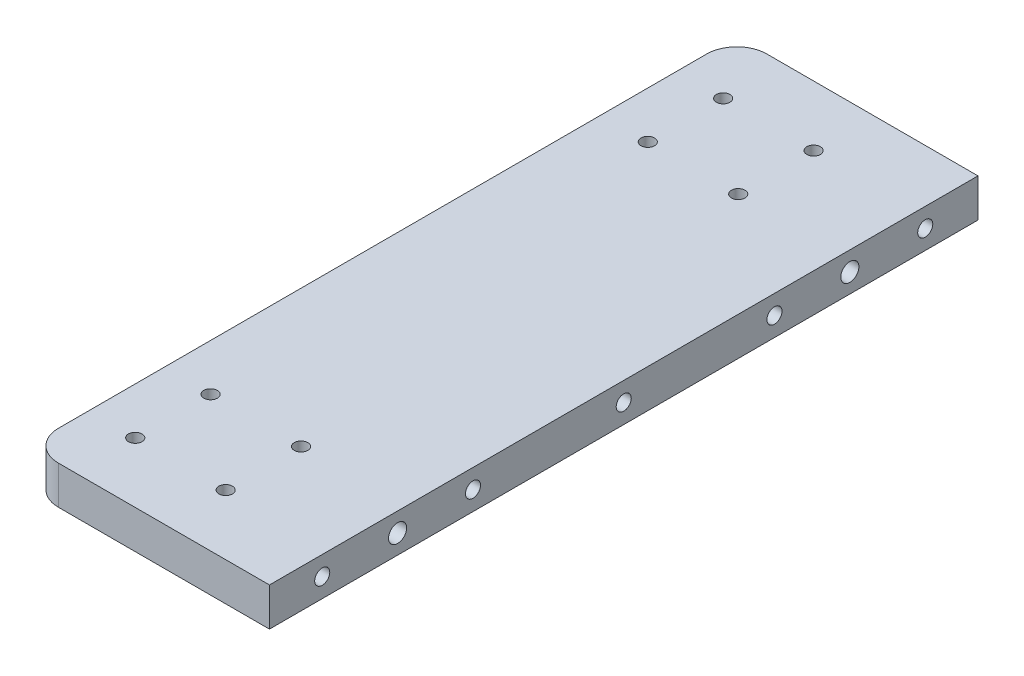
ISO-10303-21;
HEADER;
FILE_DESCRIPTION(('STEP AP214'),'2;1');
FILE_NAME('part.step','',(''),(''),'','','');
FILE_SCHEMA(('AUTOMOTIVE_DESIGN { 1 0 10303 214 1 1 1 1 }'));
ENDSEC;
DATA;
#1=APPLICATION_CONTEXT('core data for automotive mechanical design processes');
#2=APPLICATION_PROTOCOL_DEFINITION('international standard','automotive_design',2000,#1);
#3=PRODUCT_CONTEXT('',#1,'mechanical');
#4=PRODUCT('Part','Part','',(#3));
#5=PRODUCT_RELATED_PRODUCT_CATEGORY('part','',(#4));
#6=PRODUCT_DEFINITION_FORMATION('','',#4);
#7=PRODUCT_DEFINITION_CONTEXT('part definition',#1,'design');
#8=PRODUCT_DEFINITION('design','',#6,#7);
#9=PRODUCT_DEFINITION_SHAPE('','',#8);
#10=(LENGTH_UNIT() NAMED_UNIT(*) SI_UNIT(.MILLI.,.METRE.));
#11=(NAMED_UNIT(*) PLANE_ANGLE_UNIT() SI_UNIT($,.RADIAN.));
#12=(NAMED_UNIT(*) SI_UNIT($,.STERADIAN.) SOLID_ANGLE_UNIT());
#13=UNCERTAINTY_MEASURE_WITH_UNIT(LENGTH_MEASURE(1.E-05),#10,'distance_accuracy_value','');
#14=(GEOMETRIC_REPRESENTATION_CONTEXT(3) GLOBAL_UNCERTAINTY_ASSIGNED_CONTEXT((#13)) GLOBAL_UNIT_ASSIGNED_CONTEXT((#10,
#11,#12)) REPRESENTATION_CONTEXT('',''));
#15=CARTESIAN_POINT('',(0.,0.,0.));
#16=DIRECTION('',(0.,0.,1.));
#17=DIRECTION('',(1.,0.,0.));
#18=AXIS2_PLACEMENT_3D('',#15,#16,#17);
#19=CARTESIAN_POINT('',(-21.6511528103448,12.7,107.5));
#20=DIRECTION('',(0.,-1.,0.));
#21=DIRECTION('',(0.,0.,-1.));
#22=AXIS2_PLACEMENT_3D('',#19,#20,#21);
#23=PLANE('',#22);
#24=DIRECTION('',(-1.,0.,0.));
#25=VECTOR('',#24,1.);
#26=CARTESIAN_POINT('',(-21.6511528103448,12.7,-117.5));
#27=LINE('',#26,#25);
#28=CARTESIAN_POINT('',(48.3488471896552,12.7,-117.5));
#29=VERTEX_POINT('',#28);
#30=CARTESIAN_POINT('',(-21.6511528103448,12.7,-117.5));
#31=VERTEX_POINT('',#30);
#32=EDGE_CURVE('E152',#29,#31,#27,.T.);
#33=ORIENTED_EDGE('',*,*,#32,.T.);
#34=CARTESIAN_POINT('',(-21.6511528103448,12.7,-107.5));
#35=DIRECTION('',(0.,1.,0.));
#36=DIRECTION('',(0.,0.,1.));
#37=AXIS2_PLACEMENT_3D('',#34,#35,#36);
#38=CIRCLE('',#37,10.);
#39=CARTESIAN_POINT('',(-31.6511528103448,12.7,-107.5));
#40=VERTEX_POINT('',#39);
#41=EDGE_CURVE('E99',#31,#40,#38,.T.);
#42=ORIENTED_EDGE('',*,*,#41,.T.);
#43=DIRECTION('',(0.,0.,1.));
#44=VECTOR('',#43,1.);
#45=CARTESIAN_POINT('',(-31.6511528103448,12.7,-107.5));
#46=LINE('',#45,#44);
#47=CARTESIAN_POINT('',(-31.6511528103448,12.7,107.5));
#48=VERTEX_POINT('',#47);
#49=EDGE_CURVE('E113',#40,#48,#46,.T.);
#50=ORIENTED_EDGE('',*,*,#49,.T.);
#51=CARTESIAN_POINT('',(-21.6511528103448,12.7,107.5));
#52=DIRECTION('',(0.,1.,0.));
#53=DIRECTION('',(0.,0.,-1.));
#54=AXIS2_PLACEMENT_3D('',#51,#52,#53);
#55=CIRCLE('',#54,9.99999999999999);
#56=CARTESIAN_POINT('',(-21.6511528103448,12.7,117.5));
#57=VERTEX_POINT('',#56);
#58=EDGE_CURVE('E108',#48,#57,#55,.T.);
#59=ORIENTED_EDGE('',*,*,#58,.T.);
#60=DIRECTION('',(1.,0.,0.));
#61=VECTOR('',#60,1.);
#62=CARTESIAN_POINT('',(-21.6511528103448,12.7,117.5));
#63=LINE('',#62,#61);
#64=CARTESIAN_POINT('',(48.3488471896552,12.7,117.5));
#65=VERTEX_POINT('',#64);
#66=EDGE_CURVE('E114',#57,#65,#63,.T.);
#67=ORIENTED_EDGE('',*,*,#66,.T.);
#68=DIRECTION('',(0.,0.,-1.));
#69=VECTOR('',#68,1.);
#70=CARTESIAN_POINT('',(48.3488471896552,12.7,-117.5));
#71=LINE('',#70,#69);
#72=EDGE_CURVE('E64',#65,#29,#71,.T.);
#73=ORIENTED_EDGE('',*,*,#72,.T.);
#74=EDGE_LOOP('',(#33,#42,#50,#59,#67,#73));
#75=FACE_BOUND('',#74,.T.);
#76=CARTESIAN_POINT('',(-16.1761528103448,12.7,97.4999999999999));
#77=DIRECTION('',(0.,1.,0.));
#78=DIRECTION('',(0.,0.,1.));
#79=AXIS2_PLACEMENT_3D('',#76,#77,#78);
#80=CIRCLE('',#79,2.25);
#81=CARTESIAN_POINT('',(-16.1761528103448,12.7,99.7499999999999));
#82=VERTEX_POINT('',#81);
#83=EDGE_CURVE('E142',#82,#82,#80,.T.);
#84=ORIENTED_EDGE('',*,*,#83,.F.);
#85=EDGE_LOOP('',(#84));
#86=FACE_BOUND('',#85,.T.);
#87=CARTESIAN_POINT('',(-16.1761528103448,12.7,-72.5000000000001));
#88=DIRECTION('',(0.,1.,0.));
#89=DIRECTION('',(0.,0.,1.));
#90=AXIS2_PLACEMENT_3D('',#87,#88,#89);
#91=CIRCLE('',#90,2.25);
#92=CARTESIAN_POINT('',(-16.1761528103448,12.7,-70.2500000000001));
#93=VERTEX_POINT('',#92);
#94=EDGE_CURVE('E390',#93,#93,#91,.T.);
#95=ORIENTED_EDGE('',*,*,#94,.F.);
#96=EDGE_LOOP('',(#95));
#97=FACE_BOUND('',#96,.T.);
#98=CARTESIAN_POINT('',(13.8238471896552,12.7,97.4999999999999));
#99=DIRECTION('',(0.,1.,0.));
#100=DIRECTION('',(0.,0.,1.));
#101=AXIS2_PLACEMENT_3D('',#98,#99,#100);
#102=CIRCLE('',#101,2.25);
#103=CARTESIAN_POINT('',(13.8238471896552,12.7,99.7499999999999));
#104=VERTEX_POINT('',#103);
#105=EDGE_CURVE('E377',#104,#104,#102,.T.);
#106=ORIENTED_EDGE('',*,*,#105,.F.);
#107=EDGE_LOOP('',(#106));
#108=FACE_BOUND('',#107,.T.);
#109=CARTESIAN_POINT('',(13.8238471896552,12.7,72.4999999999999));
#110=DIRECTION('',(0.,1.,0.));
#111=DIRECTION('',(0.,0.,1.));
#112=AXIS2_PLACEMENT_3D('',#109,#110,#111);
#113=CIRCLE('',#112,2.25);
#114=CARTESIAN_POINT('',(13.8238471896552,12.7,74.7499999999999));
#115=VERTEX_POINT('',#114);
#116=EDGE_CURVE('E371',#115,#115,#113,.T.);
#117=ORIENTED_EDGE('',*,*,#116,.F.);
#118=EDGE_LOOP('',(#117));
#119=FACE_BOUND('',#118,.T.);
#120=CARTESIAN_POINT('',(-16.1761528103448,12.7,72.4999999999999));
#121=DIRECTION('',(0.,1.,0.));
#122=DIRECTION('',(0.,0.,1.));
#123=AXIS2_PLACEMENT_3D('',#120,#121,#122);
#124=CIRCLE('',#123,2.25);
#125=CARTESIAN_POINT('',(-16.1761528103448,12.7,74.7499999999999));
#126=VERTEX_POINT('',#125);
#127=EDGE_CURVE('E361',#126,#126,#124,.T.);
#128=ORIENTED_EDGE('',*,*,#127,.F.);
#129=EDGE_LOOP('',(#128));
#130=FACE_BOUND('',#129,.T.);
#131=CARTESIAN_POINT('',(13.8238471896552,12.7,-72.5000000000001));
#132=DIRECTION('',(0.,1.,0.));
#133=DIRECTION('',(0.,0.,1.));
#134=AXIS2_PLACEMENT_3D('',#131,#132,#133);
#135=CIRCLE('',#134,2.25);
#136=CARTESIAN_POINT('',(13.8238471896552,12.7,-70.2500000000001));
#137=VERTEX_POINT('',#136);
#138=EDGE_CURVE('E353',#137,#137,#135,.T.);
#139=ORIENTED_EDGE('',*,*,#138,.F.);
#140=EDGE_LOOP('',(#139));
#141=FACE_BOUND('',#140,.T.);
#142=CARTESIAN_POINT('',(13.8238471896552,12.7,-97.5000000000001));
#143=DIRECTION('',(0.,1.,0.));
#144=DIRECTION('',(0.,0.,1.));
#145=AXIS2_PLACEMENT_3D('',#142,#143,#144);
#146=CIRCLE('',#145,2.25);
#147=CARTESIAN_POINT('',(13.8238471896552,12.7,-95.2500000000001));
#148=VERTEX_POINT('',#147);
#149=EDGE_CURVE('E350',#148,#148,#146,.T.);
#150=ORIENTED_EDGE('',*,*,#149,.F.);
#151=EDGE_LOOP('',(#150));
#152=FACE_BOUND('',#151,.T.);
#153=CARTESIAN_POINT('',(-16.1761528103448,12.7,-97.5000000000001));
#154=DIRECTION('',(0.,1.,0.));
#155=DIRECTION('',(0.,0.,1.));
#156=AXIS2_PLACEMENT_3D('',#153,#154,#155);
#157=CIRCLE('',#156,2.25);
#158=CARTESIAN_POINT('',(-16.1761528103448,12.7,-95.2500000000001));
#159=VERTEX_POINT('',#158);
#160=EDGE_CURVE('E336',#159,#159,#157,.T.);
#161=ORIENTED_EDGE('',*,*,#160,.F.);
#162=EDGE_LOOP('',(#161));
#163=FACE_BOUND('',#162,.T.);
#164=ADVANCED_FACE('F42',(#75,#86,#97,#108,#119,#130,#141,#152,#163),#23,.F.);
#165=CARTESIAN_POINT('',(-21.6511528103448,0.,107.5));
#166=DIRECTION('',(0.,-1.,0.));
#167=DIRECTION('',(0.,0.,-1.));
#168=AXIS2_PLACEMENT_3D('',#165,#166,#167);
#169=PLANE('',#168);
#170=CARTESIAN_POINT('',(13.8238471896552,0.,-97.5000000000001));
#171=DIRECTION('',(0.,1.,0.));
#172=DIRECTION('',(0.,0.,1.));
#173=AXIS2_PLACEMENT_3D('',#170,#171,#172);
#174=CIRCLE('',#173,2.25);
#175=CARTESIAN_POINT('',(13.8238471896552,0.,-95.2500000000001));
#176=VERTEX_POINT('',#175);
#177=EDGE_CURVE('E341',#176,#176,#174,.T.);
#178=ORIENTED_EDGE('',*,*,#177,.T.);
#179=EDGE_LOOP('',(#178));
#180=FACE_BOUND('',#179,.T.);
#181=CARTESIAN_POINT('',(-16.1761528103448,0.,72.4999999999999));
#182=DIRECTION('',(0.,1.,0.));
#183=DIRECTION('',(0.,0.,1.));
#184=AXIS2_PLACEMENT_3D('',#181,#182,#183);
#185=CIRCLE('',#184,2.25);
#186=CARTESIAN_POINT('',(-16.1761528103448,0.,74.7499999999999));
#187=VERTEX_POINT('',#186);
#188=EDGE_CURVE('E359',#187,#187,#185,.T.);
#189=ORIENTED_EDGE('',*,*,#188,.T.);
#190=EDGE_LOOP('',(#189));
#191=FACE_BOUND('',#190,.T.);
#192=CARTESIAN_POINT('',(13.8238471896552,0.,97.4999999999999));
#193=DIRECTION('',(0.,1.,0.));
#194=DIRECTION('',(0.,0.,1.));
#195=AXIS2_PLACEMENT_3D('',#192,#193,#194);
#196=CIRCLE('',#195,2.25);
#197=CARTESIAN_POINT('',(13.8238471896552,0.,99.7499999999999));
#198=VERTEX_POINT('',#197);
#199=EDGE_CURVE('E374',#198,#198,#196,.T.);
#200=ORIENTED_EDGE('',*,*,#199,.T.);
#201=EDGE_LOOP('',(#200));
#202=FACE_BOUND('',#201,.T.);
#203=CARTESIAN_POINT('',(-16.1761528103448,0.,97.4999999999999));
#204=DIRECTION('',(0.,1.,0.));
#205=DIRECTION('',(0.,0.,1.));
#206=AXIS2_PLACEMENT_3D('',#203,#204,#205);
#207=CIRCLE('',#206,2.25);
#208=CARTESIAN_POINT('',(-16.1761528103448,0.,99.7499999999999));
#209=VERTEX_POINT('',#208);
#210=EDGE_CURVE('E392',#209,#209,#207,.T.);
#211=ORIENTED_EDGE('',*,*,#210,.T.);
#212=EDGE_LOOP('',(#211));
#213=FACE_BOUND('',#212,.T.);
#214=DIRECTION('',(-1.,0.,0.));
#215=VECTOR('',#214,1.);
#216=CARTESIAN_POINT('',(-21.6511528103448,0.,-117.5));
#217=LINE('',#216,#215);
#218=CARTESIAN_POINT('',(48.3488471896552,0.,-117.5));
#219=VERTEX_POINT('',#218);
#220=CARTESIAN_POINT('',(-21.6511528103448,0.,-117.5));
#221=VERTEX_POINT('',#220);
#222=EDGE_CURVE('E140',#219,#221,#217,.T.);
#223=ORIENTED_EDGE('',*,*,#222,.F.);
#224=DIRECTION('',(0.,0.,-1.));
#225=VECTOR('',#224,1.);
#226=CARTESIAN_POINT('',(48.3488471896552,0.,-117.5));
#227=LINE('',#226,#225);
#228=CARTESIAN_POINT('',(48.3488471896552,0.,117.5));
#229=VERTEX_POINT('',#228);
#230=EDGE_CURVE('E95',#229,#219,#227,.T.);
#231=ORIENTED_EDGE('',*,*,#230,.F.);
#232=DIRECTION('',(1.,0.,0.));
#233=VECTOR('',#232,1.);
#234=CARTESIAN_POINT('',(-21.6511528103448,0.,117.5));
#235=LINE('',#234,#233);
#236=CARTESIAN_POINT('',(-21.6511528103448,0.,117.5));
#237=VERTEX_POINT('',#236);
#238=EDGE_CURVE('E88',#237,#229,#235,.T.);
#239=ORIENTED_EDGE('',*,*,#238,.F.);
#240=CARTESIAN_POINT('',(-21.6511528103448,0.,107.5));
#241=DIRECTION('',(0.,1.,0.));
#242=DIRECTION('',(0.,0.,-1.));
#243=AXIS2_PLACEMENT_3D('',#240,#241,#242);
#244=CIRCLE('',#243,9.99999999999999);
#245=CARTESIAN_POINT('',(-31.6511528103448,0.,107.5));
#246=VERTEX_POINT('',#245);
#247=EDGE_CURVE('E124',#246,#237,#244,.T.);
#248=ORIENTED_EDGE('',*,*,#247,.F.);
#249=DIRECTION('',(0.,0.,1.));
#250=VECTOR('',#249,1.);
#251=CARTESIAN_POINT('',(-31.6511528103448,0.,-107.5));
#252=LINE('',#251,#250);
#253=CARTESIAN_POINT('',(-31.6511528103448,0.,-107.5));
#254=VERTEX_POINT('',#253);
#255=EDGE_CURVE('E144',#254,#246,#252,.T.);
#256=ORIENTED_EDGE('',*,*,#255,.F.);
#257=CARTESIAN_POINT('',(-21.6511528103448,0.,-107.5));
#258=DIRECTION('',(0.,1.,0.));
#259=DIRECTION('',(0.,0.,1.));
#260=AXIS2_PLACEMENT_3D('',#257,#258,#259);
#261=CIRCLE('',#260,10.);
#262=EDGE_CURVE('E143',#221,#254,#261,.T.);
#263=ORIENTED_EDGE('',*,*,#262,.F.);
#264=EDGE_LOOP('',(#223,#231,#239,#248,#256,#263));
#265=FACE_BOUND('',#264,.T.);
#266=CARTESIAN_POINT('',(-16.1761528103448,0.,-72.5000000000001));
#267=DIRECTION('',(0.,1.,0.));
#268=DIRECTION('',(0.,0.,1.));
#269=AXIS2_PLACEMENT_3D('',#266,#267,#268);
#270=CIRCLE('',#269,2.25);
#271=CARTESIAN_POINT('',(-16.1761528103448,0.,-70.2500000000001));
#272=VERTEX_POINT('',#271);
#273=EDGE_CURVE('E382',#272,#272,#270,.T.);
#274=ORIENTED_EDGE('',*,*,#273,.T.);
#275=EDGE_LOOP('',(#274));
#276=FACE_BOUND('',#275,.T.);
#277=CARTESIAN_POINT('',(13.8238471896552,0.,72.4999999999999));
#278=DIRECTION('',(0.,1.,0.));
#279=DIRECTION('',(0.,0.,1.));
#280=AXIS2_PLACEMENT_3D('',#277,#278,#279);
#281=CIRCLE('',#280,2.25);
#282=CARTESIAN_POINT('',(13.8238471896552,0.,74.7499999999999));
#283=VERTEX_POINT('',#282);
#284=EDGE_CURVE('E370',#283,#283,#281,.T.);
#285=ORIENTED_EDGE('',*,*,#284,.T.);
#286=EDGE_LOOP('',(#285));
#287=FACE_BOUND('',#286,.T.);
#288=CARTESIAN_POINT('',(13.8238471896552,0.,-72.5000000000001));
#289=DIRECTION('',(0.,1.,0.));
#290=DIRECTION('',(0.,0.,1.));
#291=AXIS2_PLACEMENT_3D('',#288,#289,#290);
#292=CIRCLE('',#291,2.25);
#293=CARTESIAN_POINT('',(13.8238471896552,0.,-70.2500000000001));
#294=VERTEX_POINT('',#293);
#295=EDGE_CURVE('E352',#294,#294,#292,.T.);
#296=ORIENTED_EDGE('',*,*,#295,.T.);
#297=EDGE_LOOP('',(#296));
#298=FACE_BOUND('',#297,.T.);
#299=CARTESIAN_POINT('',(-16.1761528103448,0.,-97.5000000000001));
#300=DIRECTION('',(0.,1.,0.));
#301=DIRECTION('',(0.,0.,1.));
#302=AXIS2_PLACEMENT_3D('',#299,#300,#301);
#303=CIRCLE('',#302,2.25);
#304=CARTESIAN_POINT('',(-16.1761528103448,0.,-95.2500000000001));
#305=VERTEX_POINT('',#304);
#306=EDGE_CURVE('E340',#305,#305,#303,.T.);
#307=ORIENTED_EDGE('',*,*,#306,.T.);
#308=EDGE_LOOP('',(#307));
#309=FACE_BOUND('',#308,.T.);
#310=ADVANCED_FACE('F170',(#180,#191,#202,#213,#265,#276,#287,#298,#309),#169,.T.);
#311=CARTESIAN_POINT('',(-21.6511528103448,12.7,-117.5));
#312=DIRECTION('',(0.,0.,1.));
#313=DIRECTION('',(1.,0.,0.));
#314=AXIS2_PLACEMENT_3D('',#311,#312,#313);
#315=PLANE('',#314);
#316=ORIENTED_EDGE('',*,*,#222,.T.);
#317=DIRECTION('',(0.,-1.,0.));
#318=VECTOR('',#317,1.);
#319=CARTESIAN_POINT('',(-21.6511528103448,12.7,-117.5));
#320=LINE('',#319,#318);
#321=EDGE_CURVE('E11',#31,#221,#320,.T.);
#322=ORIENTED_EDGE('',*,*,#321,.F.);
#323=ORIENTED_EDGE('',*,*,#32,.F.);
#324=DIRECTION('',(0.,-1.,0.));
#325=VECTOR('',#324,1.);
#326=CARTESIAN_POINT('',(48.3488471896552,12.7,-117.5));
#327=LINE('',#326,#325);
#328=EDGE_CURVE('E135',#29,#219,#327,.T.);
#329=ORIENTED_EDGE('',*,*,#328,.T.);
#330=EDGE_LOOP('',(#316,#322,#323,#329));
#331=FACE_BOUND('',#330,.T.);
#332=ADVANCED_FACE('F46',(#331),#315,.F.);
#333=CARTESIAN_POINT('',(-21.6511528103448,12.7,-107.5));
#334=DIRECTION('',(0.,-1.,0.));
#335=DIRECTION('',(0.,0.,-1.));
#336=AXIS2_PLACEMENT_3D('',#333,#334,#335);
#337=CYLINDRICAL_SURFACE('',#336,10.);
#338=ORIENTED_EDGE('',*,*,#262,.T.);
#339=DIRECTION('',(0.,-1.,0.));
#340=VECTOR('',#339,1.);
#341=CARTESIAN_POINT('',(-31.6511528103448,12.7,-107.5));
#342=LINE('',#341,#340);
#343=EDGE_CURVE('E53',#40,#254,#342,.T.);
#344=ORIENTED_EDGE('',*,*,#343,.F.);
#345=ORIENTED_EDGE('',*,*,#41,.F.);
#346=ORIENTED_EDGE('',*,*,#321,.T.);
#347=EDGE_LOOP('',(#338,#344,#345,#346));
#348=FACE_BOUND('',#347,.T.);
#349=ADVANCED_FACE('F621',(#348),#337,.T.);
#350=CARTESIAN_POINT('',(-31.6511528103448,12.7,-107.5));
#351=DIRECTION('',(1.,0.,0.));
#352=DIRECTION('',(0.,0.,-1.));
#353=AXIS2_PLACEMENT_3D('',#350,#351,#352);
#354=PLANE('',#353);
#355=ORIENTED_EDGE('',*,*,#255,.T.);
#356=DIRECTION('',(0.,-1.,0.));
#357=VECTOR('',#356,1.);
#358=CARTESIAN_POINT('',(-31.6511528103448,12.7,107.5));
#359=LINE('',#358,#357);
#360=EDGE_CURVE('E127',#48,#246,#359,.T.);
#361=ORIENTED_EDGE('',*,*,#360,.F.);
#362=ORIENTED_EDGE('',*,*,#49,.F.);
#363=ORIENTED_EDGE('',*,*,#343,.T.);
#364=EDGE_LOOP('',(#355,#361,#362,#363));
#365=FACE_BOUND('',#364,.T.);
#366=ADVANCED_FACE('F163',(#365),#354,.F.);
#367=CARTESIAN_POINT('',(-21.6511528103448,12.7,107.5));
#368=DIRECTION('',(0.,-1.,0.));
#369=DIRECTION('',(0.,0.,-1.));
#370=AXIS2_PLACEMENT_3D('',#367,#368,#369);
#371=CYLINDRICAL_SURFACE('',#370,9.99999999999999);
#372=ORIENTED_EDGE('',*,*,#247,.T.);
#373=DIRECTION('',(0.,-1.,0.));
#374=VECTOR('',#373,1.);
#375=CARTESIAN_POINT('',(-21.6511528103448,12.7,117.5));
#376=LINE('',#375,#374);
#377=EDGE_CURVE('E123',#57,#237,#376,.T.);
#378=ORIENTED_EDGE('',*,*,#377,.F.);
#379=ORIENTED_EDGE('',*,*,#58,.F.);
#380=ORIENTED_EDGE('',*,*,#360,.T.);
#381=EDGE_LOOP('',(#372,#378,#379,#380));
#382=FACE_BOUND('',#381,.T.);
#383=ADVANCED_FACE('F125',(#382),#371,.T.);
#384=CARTESIAN_POINT('',(-21.6511528103448,12.7,117.5));
#385=DIRECTION('',(0.,0.,-1.));
#386=DIRECTION('',(-1.,0.,0.));
#387=AXIS2_PLACEMENT_3D('',#384,#385,#386);
#388=PLANE('',#387);
#389=ORIENTED_EDGE('',*,*,#238,.T.);
#390=DIRECTION('',(0.,-1.,0.));
#391=VECTOR('',#390,1.);
#392=CARTESIAN_POINT('',(48.3488471896552,12.7,117.5));
#393=LINE('',#392,#391);
#394=EDGE_CURVE('E130',#65,#229,#393,.T.);
#395=ORIENTED_EDGE('',*,*,#394,.F.);
#396=ORIENTED_EDGE('',*,*,#66,.F.);
#397=ORIENTED_EDGE('',*,*,#377,.T.);
#398=EDGE_LOOP('',(#389,#395,#396,#397));
#399=FACE_BOUND('',#398,.T.);
#400=ADVANCED_FACE('F129',(#399),#388,.F.);
#401=CARTESIAN_POINT('',(48.3488471896552,12.7,-117.5));
#402=DIRECTION('',(-1.,0.,0.));
#403=DIRECTION('',(0.,0.,1.));
#404=AXIS2_PLACEMENT_3D('',#401,#402,#403);
#405=PLANE('',#404);
#406=CARTESIAN_POINT('',(48.3488471896552,6.35000000000001,-75.));
#407=DIRECTION('',(1.,0.,0.));
#408=DIRECTION('',(0.,0.,-1.));
#409=AXIS2_PLACEMENT_3D('',#406,#407,#408);
#410=CIRCLE('',#409,3.);
#411=CARTESIAN_POINT('',(48.3488471896552,6.35000000000001,-78.));
#412=VERTEX_POINT('',#411);
#413=EDGE_CURVE('E281',#412,#412,#410,.T.);
#414=ORIENTED_EDGE('',*,*,#413,.F.);
#415=EDGE_LOOP('',(#414));
#416=FACE_BOUND('',#415,.T.);
#417=CARTESIAN_POINT('',(48.3488471896552,6.35000000000001,75.));
#418=DIRECTION('',(1.,0.,0.));
#419=DIRECTION('',(0.,0.,-1.));
#420=AXIS2_PLACEMENT_3D('',#417,#418,#419);
#421=CIRCLE('',#420,3.);
#422=CARTESIAN_POINT('',(48.3488471896552,6.35000000000001,72.));
#423=VERTEX_POINT('',#422);
#424=EDGE_CURVE('E286',#423,#423,#421,.T.);
#425=ORIENTED_EDGE('',*,*,#424,.F.);
#426=EDGE_LOOP('',(#425));
#427=FACE_BOUND('',#426,.T.);
#428=CARTESIAN_POINT('',(48.3488471896552,6.35,100.));
#429=DIRECTION('',(1.,0.,0.));
#430=DIRECTION('',(0.,0.,-1.));
#431=AXIS2_PLACEMENT_3D('',#428,#429,#430);
#432=CIRCLE('',#431,2.49999999999999);
#433=CARTESIAN_POINT('',(48.3488471896552,6.35,97.5));
#434=VERTEX_POINT('',#433);
#435=EDGE_CURVE('E300',#434,#434,#432,.T.);
#436=ORIENTED_EDGE('',*,*,#435,.F.);
#437=EDGE_LOOP('',(#436));
#438=FACE_BOUND('',#437,.T.);
#439=CARTESIAN_POINT('',(48.3488471896552,6.35,50.));
#440=DIRECTION('',(1.,0.,0.));
#441=DIRECTION('',(0.,0.,-1.));
#442=AXIS2_PLACEMENT_3D('',#439,#440,#441);
#443=CIRCLE('',#442,2.49999999999999);
#444=CARTESIAN_POINT('',(48.3488471896552,6.35,47.5));
#445=VERTEX_POINT('',#444);
#446=EDGE_CURVE('E308',#445,#445,#443,.T.);
#447=ORIENTED_EDGE('',*,*,#446,.F.);
#448=EDGE_LOOP('',(#447));
#449=FACE_BOUND('',#448,.T.);
#450=CARTESIAN_POINT('',(48.3488471896552,6.35,0.));
#451=DIRECTION('',(1.,0.,0.));
#452=DIRECTION('',(0.,0.,-1.));
#453=AXIS2_PLACEMENT_3D('',#450,#451,#452);
#454=CIRCLE('',#453,2.49999999999999);
#455=CARTESIAN_POINT('',(48.3488471896552,6.35,-2.49999999999995));
#456=VERTEX_POINT('',#455);
#457=EDGE_CURVE('E314',#456,#456,#454,.T.);
#458=ORIENTED_EDGE('',*,*,#457,.F.);
#459=EDGE_LOOP('',(#458));
#460=FACE_BOUND('',#459,.T.);
#461=CARTESIAN_POINT('',(48.3488471896552,6.35,-50.));
#462=DIRECTION('',(1.,0.,0.));
#463=DIRECTION('',(0.,0.,-1.));
#464=AXIS2_PLACEMENT_3D('',#461,#462,#463);
#465=CIRCLE('',#464,2.49999999999999);
#466=CARTESIAN_POINT('',(48.3488471896552,6.35,-52.5));
#467=VERTEX_POINT('',#466);
#468=EDGE_CURVE('E325',#467,#467,#465,.T.);
#469=ORIENTED_EDGE('',*,*,#468,.F.);
#470=EDGE_LOOP('',(#469));
#471=FACE_BOUND('',#470,.T.);
#472=CARTESIAN_POINT('',(48.3488471896552,6.35,-100.));
#473=DIRECTION('',(1.,0.,0.));
#474=DIRECTION('',(0.,0.,-1.));
#475=AXIS2_PLACEMENT_3D('',#472,#473,#474);
#476=CIRCLE('',#475,2.49999999999999);
#477=CARTESIAN_POINT('',(48.3488471896552,6.35,-102.5));
#478=VERTEX_POINT('',#477);
#479=EDGE_CURVE('E329',#478,#478,#476,.T.);
#480=ORIENTED_EDGE('',*,*,#479,.F.);
#481=EDGE_LOOP('',(#480));
#482=FACE_BOUND('',#481,.T.);
#483=ORIENTED_EDGE('',*,*,#230,.T.);
#484=ORIENTED_EDGE('',*,*,#328,.F.);
#485=ORIENTED_EDGE('',*,*,#72,.F.);
#486=ORIENTED_EDGE('',*,*,#394,.T.);
#487=EDGE_LOOP('',(#483,#484,#485,#486));
#488=FACE_BOUND('',#487,.T.);
#489=ADVANCED_FACE('F174',(#416,#427,#438,#449,#460,#471,#482,#488),#405,.F.);
#490=CARTESIAN_POINT('',(-16.1761528103448,12.7,97.4999999999999));
#491=DIRECTION('',(0.,-1.,0.));
#492=DIRECTION('',(0.,0.,-1.));
#493=AXIS2_PLACEMENT_3D('',#490,#491,#492);
#494=CYLINDRICAL_SURFACE('',#493,2.25);
#495=ORIENTED_EDGE('',*,*,#83,.T.);
#496=EDGE_LOOP('',(#495));
#497=FACE_BOUND('',#496,.T.);
#498=ORIENTED_EDGE('',*,*,#210,.F.);
#499=EDGE_LOOP('',(#498));
#500=FACE_BOUND('',#499,.T.);
#501=ADVANCED_FACE('F171',(#497,#500),#494,.F.);
#502=CARTESIAN_POINT('',(-16.1761528103448,12.7,-72.5000000000001));
#503=DIRECTION('',(0.,-1.,0.));
#504=DIRECTION('',(0.,0.,-1.));
#505=AXIS2_PLACEMENT_3D('',#502,#503,#504);
#506=CYLINDRICAL_SURFACE('',#505,2.25);
#507=ORIENTED_EDGE('',*,*,#94,.T.);
#508=EDGE_LOOP('',(#507));
#509=FACE_BOUND('',#508,.T.);
#510=ORIENTED_EDGE('',*,*,#273,.F.);
#511=EDGE_LOOP('',(#510));
#512=FACE_BOUND('',#511,.T.);
#513=ADVANCED_FACE('F185',(#509,#512),#506,.F.);
#514=CARTESIAN_POINT('',(13.8238471896552,12.7,97.4999999999999));
#515=DIRECTION('',(0.,-1.,0.));
#516=DIRECTION('',(0.,0.,-1.));
#517=AXIS2_PLACEMENT_3D('',#514,#515,#516);
#518=CYLINDRICAL_SURFACE('',#517,2.25);
#519=ORIENTED_EDGE('',*,*,#105,.T.);
#520=EDGE_LOOP('',(#519));
#521=FACE_BOUND('',#520,.T.);
#522=ORIENTED_EDGE('',*,*,#199,.F.);
#523=EDGE_LOOP('',(#522));
#524=FACE_BOUND('',#523,.T.);
#525=ADVANCED_FACE('F200',(#521,#524),#518,.F.);
#526=CARTESIAN_POINT('',(13.8238471896552,12.7,72.4999999999999));
#527=DIRECTION('',(0.,-1.,0.));
#528=DIRECTION('',(0.,0.,-1.));
#529=AXIS2_PLACEMENT_3D('',#526,#527,#528);
#530=CYLINDRICAL_SURFACE('',#529,2.25);
#531=ORIENTED_EDGE('',*,*,#116,.T.);
#532=EDGE_LOOP('',(#531));
#533=FACE_BOUND('',#532,.T.);
#534=ORIENTED_EDGE('',*,*,#284,.F.);
#535=EDGE_LOOP('',(#534));
#536=FACE_BOUND('',#535,.T.);
#537=ADVANCED_FACE('F201',(#533,#536),#530,.F.);
#538=CARTESIAN_POINT('',(-16.1761528103448,12.7,72.4999999999999));
#539=DIRECTION('',(0.,-1.,0.));
#540=DIRECTION('',(0.,0.,-1.));
#541=AXIS2_PLACEMENT_3D('',#538,#539,#540);
#542=CYLINDRICAL_SURFACE('',#541,2.25);
#543=ORIENTED_EDGE('',*,*,#127,.T.);
#544=EDGE_LOOP('',(#543));
#545=FACE_BOUND('',#544,.T.);
#546=ORIENTED_EDGE('',*,*,#188,.F.);
#547=EDGE_LOOP('',(#546));
#548=FACE_BOUND('',#547,.T.);
#549=ADVANCED_FACE('F210',(#545,#548),#542,.F.);
#550=CARTESIAN_POINT('',(13.8238471896552,12.7,-72.5000000000001));
#551=DIRECTION('',(0.,-1.,0.));
#552=DIRECTION('',(0.,0.,-1.));
#553=AXIS2_PLACEMENT_3D('',#550,#551,#552);
#554=CYLINDRICAL_SURFACE('',#553,2.25);
#555=ORIENTED_EDGE('',*,*,#138,.T.);
#556=EDGE_LOOP('',(#555));
#557=FACE_BOUND('',#556,.T.);
#558=ORIENTED_EDGE('',*,*,#295,.F.);
#559=EDGE_LOOP('',(#558));
#560=FACE_BOUND('',#559,.T.);
#561=ADVANCED_FACE('F211',(#557,#560),#554,.F.);
#562=CARTESIAN_POINT('',(13.8238471896552,12.7,-97.5000000000001));
#563=DIRECTION('',(0.,-1.,0.));
#564=DIRECTION('',(0.,0.,-1.));
#565=AXIS2_PLACEMENT_3D('',#562,#563,#564);
#566=CYLINDRICAL_SURFACE('',#565,2.25);
#567=ORIENTED_EDGE('',*,*,#149,.T.);
#568=EDGE_LOOP('',(#567));
#569=FACE_BOUND('',#568,.T.);
#570=ORIENTED_EDGE('',*,*,#177,.F.);
#571=EDGE_LOOP('',(#570));
#572=FACE_BOUND('',#571,.T.);
#573=ADVANCED_FACE('F214',(#569,#572),#566,.F.);
#574=CARTESIAN_POINT('',(-16.1761528103448,12.7,-97.5000000000001));
#575=DIRECTION('',(0.,-1.,0.));
#576=DIRECTION('',(0.,0.,-1.));
#577=AXIS2_PLACEMENT_3D('',#574,#575,#576);
#578=CYLINDRICAL_SURFACE('',#577,2.25);
#579=ORIENTED_EDGE('',*,*,#160,.T.);
#580=EDGE_LOOP('',(#579));
#581=FACE_BOUND('',#580,.T.);
#582=ORIENTED_EDGE('',*,*,#306,.F.);
#583=EDGE_LOOP('',(#582));
#584=FACE_BOUND('',#583,.T.);
#585=ADVANCED_FACE('F218',(#581,#584),#578,.F.);
#586=CARTESIAN_POINT('',(31.3488471896552,6.35,-100.));
#587=DIRECTION('',(1.,0.,0.));
#588=DIRECTION('',(0.,0.,-1.));
#589=AXIS2_PLACEMENT_3D('',#586,#587,#588);
#590=CONICAL_SURFACE('',#589,2.5,1.02974425867665);
#591=CARTESIAN_POINT('',(29.8466956420863,6.35,-100.));
#592=VERTEX_POINT('',#591);
#593=VERTEX_LOOP('',#592);
#594=FACE_BOUND('',#593,.T.);
#595=CARTESIAN_POINT('',(31.3488471896552,6.35,-100.));
#596=DIRECTION('',(1.,0.,0.));
#597=DIRECTION('',(0.,0.,-1.));
#598=AXIS2_PLACEMENT_3D('',#595,#596,#597);
#599=CIRCLE('',#598,2.5);
#600=CARTESIAN_POINT('',(31.3488471896552,6.35,-102.5));
#601=VERTEX_POINT('',#600);
#602=EDGE_CURVE('E331',#601,#601,#599,.T.);
#603=ORIENTED_EDGE('',*,*,#602,.T.);
#604=EDGE_LOOP('',(#603));
#605=FACE_BOUND('',#604,.T.);
#606=ADVANCED_FACE('F224',(#594,#605),#590,.F.);
#607=CARTESIAN_POINT('',(48.3488471896552,6.35,-100.));
#608=DIRECTION('',(1.,0.,0.));
#609=DIRECTION('',(0.,0.,-1.));
#610=AXIS2_PLACEMENT_3D('',#607,#608,#609);
#611=CYLINDRICAL_SURFACE('',#610,2.49999999999999);
#612=ORIENTED_EDGE('',*,*,#602,.F.);
#613=EDGE_LOOP('',(#612));
#614=FACE_BOUND('',#613,.T.);
#615=ORIENTED_EDGE('',*,*,#479,.T.);
#616=EDGE_LOOP('',(#615));
#617=FACE_BOUND('',#616,.T.);
#618=ADVANCED_FACE('F229',(#614,#617),#611,.F.);
#619=CARTESIAN_POINT('',(31.3488471896552,6.35,-50.));
#620=DIRECTION('',(1.,0.,0.));
#621=DIRECTION('',(0.,0.,-1.));
#622=AXIS2_PLACEMENT_3D('',#619,#620,#621);
#623=CONICAL_SURFACE('',#622,2.5,1.02974425867665);
#624=CARTESIAN_POINT('',(29.8466956420863,6.35,-50.));
#625=VERTEX_POINT('',#624);
#626=VERTEX_LOOP('',#625);
#627=FACE_BOUND('',#626,.T.);
#628=CARTESIAN_POINT('',(31.3488471896552,6.35,-50.));
#629=DIRECTION('',(1.,0.,0.));
#630=DIRECTION('',(0.,0.,-1.));
#631=AXIS2_PLACEMENT_3D('',#628,#629,#630);
#632=CIRCLE('',#631,2.5);
#633=CARTESIAN_POINT('',(31.3488471896552,6.35,-52.5));
#634=VERTEX_POINT('',#633);
#635=EDGE_CURVE('E326',#634,#634,#632,.T.);
#636=ORIENTED_EDGE('',*,*,#635,.T.);
#637=EDGE_LOOP('',(#636));
#638=FACE_BOUND('',#637,.T.);
#639=ADVANCED_FACE('F233',(#627,#638),#623,.F.);
#640=CARTESIAN_POINT('',(48.3488471896552,6.35,-50.));
#641=DIRECTION('',(1.,0.,0.));
#642=DIRECTION('',(0.,0.,-1.));
#643=AXIS2_PLACEMENT_3D('',#640,#641,#642);
#644=CYLINDRICAL_SURFACE('',#643,2.49999999999999);
#645=ORIENTED_EDGE('',*,*,#635,.F.);
#646=EDGE_LOOP('',(#645));
#647=FACE_BOUND('',#646,.T.);
#648=ORIENTED_EDGE('',*,*,#468,.T.);
#649=EDGE_LOOP('',(#648));
#650=FACE_BOUND('',#649,.T.);
#651=ADVANCED_FACE('F232',(#647,#650),#644,.F.);
#652=CARTESIAN_POINT('',(31.3488471896552,6.35,0.));
#653=DIRECTION('',(1.,0.,0.));
#654=DIRECTION('',(0.,0.,-1.));
#655=AXIS2_PLACEMENT_3D('',#652,#653,#654);
#656=CONICAL_SURFACE('',#655,2.5,1.02974425867665);
#657=CARTESIAN_POINT('',(29.8466956420863,6.35,0.));
#658=VERTEX_POINT('',#657);
#659=VERTEX_LOOP('',#658);
#660=FACE_BOUND('',#659,.T.);
#661=CARTESIAN_POINT('',(31.3488471896552,6.35,0.));
#662=DIRECTION('',(1.,0.,0.));
#663=DIRECTION('',(0.,0.,-1.));
#664=AXIS2_PLACEMENT_3D('',#661,#662,#663);
#665=CIRCLE('',#664,2.5);
#666=CARTESIAN_POINT('',(31.3488471896552,6.35,-2.49999999999995));
#667=VERTEX_POINT('',#666);
#668=EDGE_CURVE('E318',#667,#667,#665,.T.);
#669=ORIENTED_EDGE('',*,*,#668,.T.);
#670=EDGE_LOOP('',(#669));
#671=FACE_BOUND('',#670,.T.);
#672=ADVANCED_FACE('F239',(#660,#671),#656,.F.);
#673=CARTESIAN_POINT('',(48.3488471896552,6.35,0.));
#674=DIRECTION('',(1.,0.,0.));
#675=DIRECTION('',(0.,0.,-1.));
#676=AXIS2_PLACEMENT_3D('',#673,#674,#675);
#677=CYLINDRICAL_SURFACE('',#676,2.49999999999999);
#678=ORIENTED_EDGE('',*,*,#668,.F.);
#679=EDGE_LOOP('',(#678));
#680=FACE_BOUND('',#679,.T.);
#681=ORIENTED_EDGE('',*,*,#457,.T.);
#682=EDGE_LOOP('',(#681));
#683=FACE_BOUND('',#682,.T.);
#684=ADVANCED_FACE('F245',(#680,#683),#677,.F.);
#685=CARTESIAN_POINT('',(31.3488471896552,6.35,50.));
#686=DIRECTION('',(1.,0.,0.));
#687=DIRECTION('',(0.,0.,-1.));
#688=AXIS2_PLACEMENT_3D('',#685,#686,#687);
#689=CONICAL_SURFACE('',#688,2.5,1.02974425867665);
#690=CARTESIAN_POINT('',(29.8466956420863,6.35,50.));
#691=VERTEX_POINT('',#690);
#692=VERTEX_LOOP('',#691);
#693=FACE_BOUND('',#692,.T.);
#694=CARTESIAN_POINT('',(31.3488471896552,6.35,50.));
#695=DIRECTION('',(1.,0.,0.));
#696=DIRECTION('',(0.,0.,-1.));
#697=AXIS2_PLACEMENT_3D('',#694,#695,#696);
#698=CIRCLE('',#697,2.5);
#699=CARTESIAN_POINT('',(31.3488471896552,6.35,47.5));
#700=VERTEX_POINT('',#699);
#701=EDGE_CURVE('E309',#700,#700,#698,.T.);
#702=ORIENTED_EDGE('',*,*,#701,.T.);
#703=EDGE_LOOP('',(#702));
#704=FACE_BOUND('',#703,.T.);
#705=ADVANCED_FACE('F250',(#693,#704),#689,.F.);
#706=CARTESIAN_POINT('',(48.3488471896552,6.35,50.));
#707=DIRECTION('',(1.,0.,0.));
#708=DIRECTION('',(0.,0.,-1.));
#709=AXIS2_PLACEMENT_3D('',#706,#707,#708);
#710=CYLINDRICAL_SURFACE('',#709,2.49999999999999);
#711=ORIENTED_EDGE('',*,*,#701,.F.);
#712=EDGE_LOOP('',(#711));
#713=FACE_BOUND('',#712,.T.);
#714=ORIENTED_EDGE('',*,*,#446,.T.);
#715=EDGE_LOOP('',(#714));
#716=FACE_BOUND('',#715,.T.);
#717=ADVANCED_FACE('F253',(#713,#716),#710,.F.);
#718=CARTESIAN_POINT('',(31.3488471896552,6.35,100.));
#719=DIRECTION('',(1.,0.,0.));
#720=DIRECTION('',(0.,0.,-1.));
#721=AXIS2_PLACEMENT_3D('',#718,#719,#720);
#722=CONICAL_SURFACE('',#721,2.5,1.02974425867665);
#723=CARTESIAN_POINT('',(29.8466956420863,6.35,100.));
#724=VERTEX_POINT('',#723);
#725=VERTEX_LOOP('',#724);
#726=FACE_BOUND('',#725,.T.);
#727=CARTESIAN_POINT('',(31.3488471896552,6.35,100.));
#728=DIRECTION('',(1.,0.,0.));
#729=DIRECTION('',(0.,0.,-1.));
#730=AXIS2_PLACEMENT_3D('',#727,#728,#729);
#731=CIRCLE('',#730,2.5);
#732=CARTESIAN_POINT('',(31.3488471896552,6.35,97.5));
#733=VERTEX_POINT('',#732);
#734=EDGE_CURVE('E305',#733,#733,#731,.T.);
#735=ORIENTED_EDGE('',*,*,#734,.T.);
#736=EDGE_LOOP('',(#735));
#737=FACE_BOUND('',#736,.T.);
#738=ADVANCED_FACE('F254',(#726,#737),#722,.F.);
#739=CARTESIAN_POINT('',(48.3488471896552,6.35,100.));
#740=DIRECTION('',(1.,0.,0.));
#741=DIRECTION('',(0.,0.,-1.));
#742=AXIS2_PLACEMENT_3D('',#739,#740,#741);
#743=CYLINDRICAL_SURFACE('',#742,2.49999999999999);
#744=ORIENTED_EDGE('',*,*,#734,.F.);
#745=EDGE_LOOP('',(#744));
#746=FACE_BOUND('',#745,.T.);
#747=ORIENTED_EDGE('',*,*,#435,.T.);
#748=EDGE_LOOP('',(#747));
#749=FACE_BOUND('',#748,.T.);
#750=ADVANCED_FACE('F259',(#746,#749),#743,.F.);
#751=CARTESIAN_POINT('',(31.3488471896552,6.35000000000001,75.));
#752=DIRECTION('',(1.,0.,0.));
#753=DIRECTION('',(0.,0.,-1.));
#754=AXIS2_PLACEMENT_3D('',#751,#752,#753);
#755=CONICAL_SURFACE('',#754,3.,1.02974425867665);
#756=CARTESIAN_POINT('',(29.5462653325725,6.35,75.));
#757=VERTEX_POINT('',#756);
#758=VERTEX_LOOP('',#757);
#759=FACE_BOUND('',#758,.T.);
#760=CARTESIAN_POINT('',(31.3488471896552,6.35000000000001,75.));
#761=DIRECTION('',(1.,0.,0.));
#762=DIRECTION('',(0.,0.,-1.));
#763=AXIS2_PLACEMENT_3D('',#760,#761,#762);
#764=CIRCLE('',#763,3.);
#765=CARTESIAN_POINT('',(31.3488471896552,6.35000000000001,72.));
#766=VERTEX_POINT('',#765);
#767=EDGE_CURVE('E294',#766,#766,#764,.T.);
#768=ORIENTED_EDGE('',*,*,#767,.T.);
#769=EDGE_LOOP('',(#768));
#770=FACE_BOUND('',#769,.T.);
#771=ADVANCED_FACE('F265',(#759,#770),#755,.F.);
#772=CARTESIAN_POINT('',(48.3488471896552,6.35000000000001,75.));
#773=DIRECTION('',(1.,0.,0.));
#774=DIRECTION('',(0.,0.,-1.));
#775=AXIS2_PLACEMENT_3D('',#772,#773,#774);
#776=CYLINDRICAL_SURFACE('',#775,3.);
#777=ORIENTED_EDGE('',*,*,#767,.F.);
#778=EDGE_LOOP('',(#777));
#779=FACE_BOUND('',#778,.T.);
#780=ORIENTED_EDGE('',*,*,#424,.T.);
#781=EDGE_LOOP('',(#780));
#782=FACE_BOUND('',#781,.T.);
#783=ADVANCED_FACE('F264',(#779,#782),#776,.F.);
#784=CARTESIAN_POINT('',(31.3488471896552,6.35000000000001,-75.));
#785=DIRECTION('',(1.,0.,0.));
#786=DIRECTION('',(0.,0.,-1.));
#787=AXIS2_PLACEMENT_3D('',#784,#785,#786);
#788=CONICAL_SURFACE('',#787,3.,1.02974425867665);
#789=CARTESIAN_POINT('',(29.5462653325725,6.35,-75.));
#790=VERTEX_POINT('',#789);
#791=VERTEX_LOOP('',#790);
#792=FACE_BOUND('',#791,.T.);
#793=CARTESIAN_POINT('',(31.3488471896552,6.35000000000001,-75.));
#794=DIRECTION('',(1.,0.,0.));
#795=DIRECTION('',(0.,0.,-1.));
#796=AXIS2_PLACEMENT_3D('',#793,#794,#795);
#797=CIRCLE('',#796,3.);
#798=CARTESIAN_POINT('',(31.3488471896552,6.35000000000001,-78.));
#799=VERTEX_POINT('',#798);
#800=EDGE_CURVE('E284',#799,#799,#797,.T.);
#801=ORIENTED_EDGE('',*,*,#800,.T.);
#802=EDGE_LOOP('',(#801));
#803=FACE_BOUND('',#802,.T.);
#804=ADVANCED_FACE('F267',(#792,#803),#788,.F.);
#805=CARTESIAN_POINT('',(48.3488471896552,6.35000000000001,-75.));
#806=DIRECTION('',(1.,0.,0.));
#807=DIRECTION('',(0.,0.,-1.));
#808=AXIS2_PLACEMENT_3D('',#805,#806,#807);
#809=CYLINDRICAL_SURFACE('',#808,3.);
#810=ORIENTED_EDGE('',*,*,#800,.F.);
#811=EDGE_LOOP('',(#810));
#812=FACE_BOUND('',#811,.T.);
#813=ORIENTED_EDGE('',*,*,#413,.T.);
#814=EDGE_LOOP('',(#813));
#815=FACE_BOUND('',#814,.T.);
#816=ADVANCED_FACE('F272',(#812,#815),#809,.F.);
#817=CLOSED_SHELL('',(#164,#310,#332,#349,#366,#383,#400,#489,#501,#513,#525,#537,#549,#561,
#573,#585,#606,#618,#639,#651,#672,#684,#705,#717,#738,#750,#771,#783,#804,#816));
#818=MANIFOLD_SOLID_BREP('B2',#817);
#819=ADVANCED_BREP_SHAPE_REPRESENTATION('',(#18,#818),#14);
#820=SHAPE_DEFINITION_REPRESENTATION(#9,#819);
ENDSEC;
END-ISO-10303-21;
